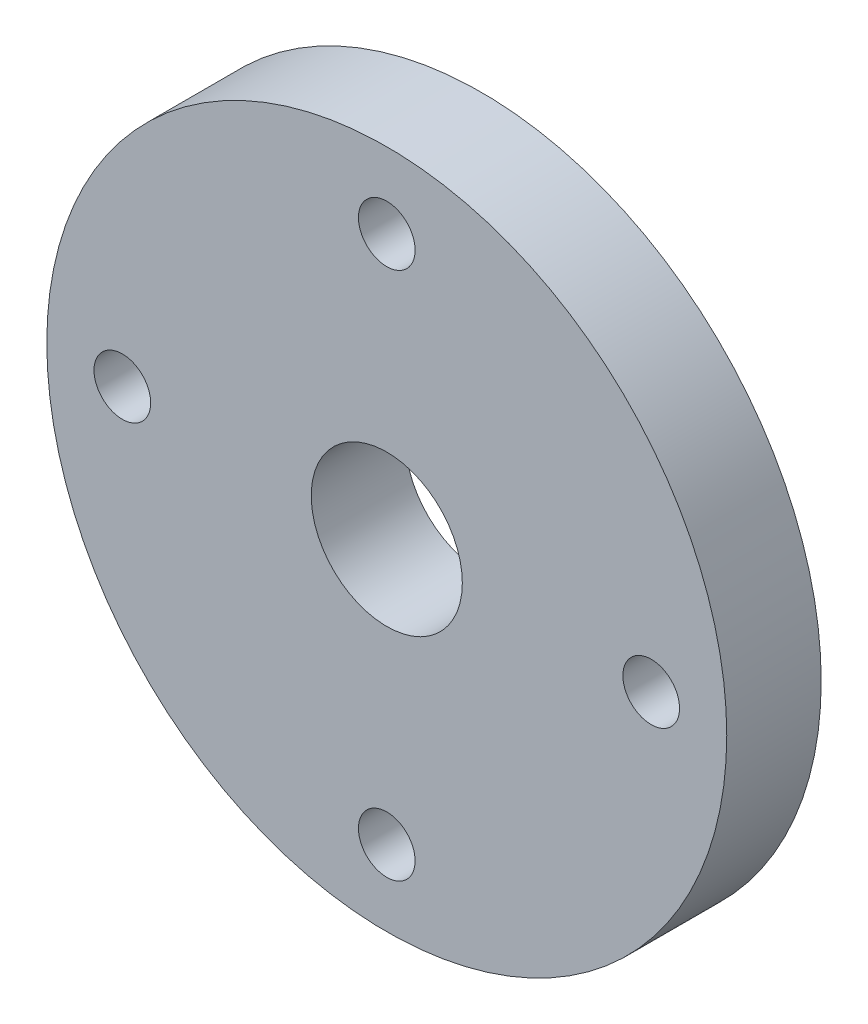
ISO-10303-21;
HEADER;
FILE_DESCRIPTION(('STEP AP214'),'2;1');
FILE_NAME('part.step','',(''),(''),'','','');
FILE_SCHEMA(('AUTOMOTIVE_DESIGN { 1 0 10303 214 1 1 1 1 }'));
ENDSEC;
DATA;
#1=APPLICATION_CONTEXT('core data for automotive mechanical design processes');
#2=APPLICATION_PROTOCOL_DEFINITION('international standard','automotive_design',2000,#1);
#3=PRODUCT_CONTEXT('',#1,'mechanical');
#4=PRODUCT('Part','Part','',(#3));
#5=PRODUCT_RELATED_PRODUCT_CATEGORY('part','',(#4));
#6=PRODUCT_DEFINITION_FORMATION('','',#4);
#7=PRODUCT_DEFINITION_CONTEXT('part definition',#1,'design');
#8=PRODUCT_DEFINITION('design','',#6,#7);
#9=PRODUCT_DEFINITION_SHAPE('','',#8);
#10=(LENGTH_UNIT() NAMED_UNIT(*) SI_UNIT(.MILLI.,.METRE.));
#11=(NAMED_UNIT(*) PLANE_ANGLE_UNIT() SI_UNIT($,.RADIAN.));
#12=(NAMED_UNIT(*) SI_UNIT($,.STERADIAN.) SOLID_ANGLE_UNIT());
#13=UNCERTAINTY_MEASURE_WITH_UNIT(LENGTH_MEASURE(1.E-05),#10,'distance_accuracy_value','');
#14=(GEOMETRIC_REPRESENTATION_CONTEXT(3) GLOBAL_UNCERTAINTY_ASSIGNED_CONTEXT((#13)) GLOBAL_UNIT_ASSIGNED_CONTEXT((#10,
#11,#12)) REPRESENTATION_CONTEXT('',''));
#15=CARTESIAN_POINT('',(0.,0.,0.));
#16=DIRECTION('',(0.,0.,1.));
#17=DIRECTION('',(1.,0.,0.));
#18=AXIS2_PLACEMENT_3D('',#15,#16,#17);
#19=CARTESIAN_POINT('',(0.,0.,5.));
#20=DIRECTION('',(0.,0.,-1.));
#21=DIRECTION('',(-1.,0.,0.));
#22=AXIS2_PLACEMENT_3D('',#19,#20,#21);
#23=CYLINDRICAL_SURFACE('',#22,18.);
#24=CARTESIAN_POINT('',(0.,0.,5.));
#25=DIRECTION('',(0.,0.,1.));
#26=DIRECTION('',(1.,0.,0.));
#27=AXIS2_PLACEMENT_3D('',#24,#25,#26);
#28=CIRCLE('',#27,18.);
#29=CARTESIAN_POINT('',(18.,0.,5.));
#30=VERTEX_POINT('',#29);
#31=EDGE_CURVE('E10',#30,#30,#28,.T.);
#32=ORIENTED_EDGE('',*,*,#31,.F.);
#33=EDGE_LOOP('',(#32));
#34=FACE_BOUND('',#33,.T.);
#35=CARTESIAN_POINT('',(0.,0.,0.));
#36=DIRECTION('',(0.,0.,1.));
#37=DIRECTION('',(1.,0.,0.));
#38=AXIS2_PLACEMENT_3D('',#35,#36,#37);
#39=CIRCLE('',#38,18.);
#40=CARTESIAN_POINT('',(18.,0.,0.));
#41=VERTEX_POINT('',#40);
#42=EDGE_CURVE('E42',#41,#41,#39,.T.);
#43=ORIENTED_EDGE('',*,*,#42,.T.);
#44=EDGE_LOOP('',(#43));
#45=FACE_BOUND('',#44,.T.);
#46=ADVANCED_FACE('F35',(#34,#45),#23,.T.);
#47=CARTESIAN_POINT('',(0.,0.,5.));
#48=DIRECTION('',(0.,0.,1.));
#49=DIRECTION('',(1.,0.,0.));
#50=AXIS2_PLACEMENT_3D('',#47,#48,#49);
#51=PLANE('',#50);
#52=CARTESIAN_POINT('',(0.,14.,5.));
#53=DIRECTION('',(0.,0.,-1.));
#54=DIRECTION('',(-1.,0.,0.));
#55=AXIS2_PLACEMENT_3D('',#52,#53,#54);
#56=CIRCLE('',#55,1.5);
#57=CARTESIAN_POINT('',(-1.5,14.,5.));
#58=VERTEX_POINT('',#57);
#59=EDGE_CURVE('E51',#58,#58,#56,.T.);
#60=ORIENTED_EDGE('',*,*,#59,.T.);
#61=EDGE_LOOP('',(#60));
#62=FACE_BOUND('',#61,.T.);
#63=CARTESIAN_POINT('',(-14.,0.,5.));
#64=DIRECTION('',(0.,0.,-1.));
#65=DIRECTION('',(-1.,0.,0.));
#66=AXIS2_PLACEMENT_3D('',#63,#64,#65);
#67=CIRCLE('',#66,1.5);
#68=CARTESIAN_POINT('',(-15.5,0.,5.));
#69=VERTEX_POINT('',#68);
#70=EDGE_CURVE('E67',#69,#69,#67,.T.);
#71=ORIENTED_EDGE('',*,*,#70,.T.);
#72=EDGE_LOOP('',(#71));
#73=FACE_BOUND('',#72,.T.);
#74=CARTESIAN_POINT('',(0.,-14.,5.));
#75=DIRECTION('',(0.,0.,-1.));
#76=DIRECTION('',(-1.,0.,0.));
#77=AXIS2_PLACEMENT_3D('',#74,#75,#76);
#78=CIRCLE('',#77,1.5);
#79=CARTESIAN_POINT('',(-1.5,-14.,5.));
#80=VERTEX_POINT('',#79);
#81=EDGE_CURVE('E61',#80,#80,#78,.T.);
#82=ORIENTED_EDGE('',*,*,#81,.T.);
#83=EDGE_LOOP('',(#82));
#84=FACE_BOUND('',#83,.T.);
#85=CARTESIAN_POINT('',(14.,0.,5.));
#86=DIRECTION('',(0.,0.,-1.));
#87=DIRECTION('',(-1.,0.,0.));
#88=AXIS2_PLACEMENT_3D('',#85,#86,#87);
#89=CIRCLE('',#88,1.5);
#90=CARTESIAN_POINT('',(12.5,0.,5.));
#91=VERTEX_POINT('',#90);
#92=EDGE_CURVE('E55',#91,#91,#89,.T.);
#93=ORIENTED_EDGE('',*,*,#92,.T.);
#94=EDGE_LOOP('',(#93));
#95=FACE_BOUND('',#94,.T.);
#96=CARTESIAN_POINT('',(0.,0.,5.));
#97=DIRECTION('',(0.,0.,1.));
#98=DIRECTION('',(1.,0.,0.));
#99=AXIS2_PLACEMENT_3D('',#96,#97,#98);
#100=CIRCLE('',#99,4.);
#101=CARTESIAN_POINT('',(4.,0.,4.99999999999999));
#102=VERTEX_POINT('',#101);
#103=EDGE_CURVE('E48',#102,#102,#100,.T.);
#104=ORIENTED_EDGE('',*,*,#103,.F.);
#105=EDGE_LOOP('',(#104));
#106=FACE_BOUND('',#105,.T.);
#107=ORIENTED_EDGE('',*,*,#31,.T.);
#108=EDGE_LOOP('',(#107));
#109=FACE_BOUND('',#108,.T.);
#110=ADVANCED_FACE('F76',(#62,#73,#84,#95,#106,#109),#51,.T.);
#111=CARTESIAN_POINT('',(0.,0.,0.));
#112=DIRECTION('',(0.,0.,1.));
#113=DIRECTION('',(1.,0.,0.));
#114=AXIS2_PLACEMENT_3D('',#111,#112,#113);
#115=PLANE('',#114);
#116=CARTESIAN_POINT('',(0.,14.,0.));
#117=DIRECTION('',(0.,0.,-1.));
#118=DIRECTION('',(-1.,0.,0.));
#119=AXIS2_PLACEMENT_3D('',#116,#117,#118);
#120=CIRCLE('',#119,1.5);
#121=CARTESIAN_POINT('',(-1.5,14.,0.));
#122=VERTEX_POINT('',#121);
#123=EDGE_CURVE('E70',#122,#122,#120,.T.);
#124=ORIENTED_EDGE('',*,*,#123,.F.);
#125=EDGE_LOOP('',(#124));
#126=FACE_BOUND('',#125,.T.);
#127=CARTESIAN_POINT('',(-14.,0.,0.));
#128=DIRECTION('',(0.,0.,-1.));
#129=DIRECTION('',(-1.,0.,0.));
#130=AXIS2_PLACEMENT_3D('',#127,#128,#129);
#131=CIRCLE('',#130,1.5);
#132=CARTESIAN_POINT('',(-15.5,0.,0.));
#133=VERTEX_POINT('',#132);
#134=EDGE_CURVE('E64',#133,#133,#131,.T.);
#135=ORIENTED_EDGE('',*,*,#134,.F.);
#136=EDGE_LOOP('',(#135));
#137=FACE_BOUND('',#136,.T.);
#138=CARTESIAN_POINT('',(0.,-14.,0.));
#139=DIRECTION('',(0.,0.,-1.));
#140=DIRECTION('',(-1.,0.,0.));
#141=AXIS2_PLACEMENT_3D('',#138,#139,#140);
#142=CIRCLE('',#141,1.5);
#143=CARTESIAN_POINT('',(-1.5,-14.,0.));
#144=VERTEX_POINT('',#143);
#145=EDGE_CURVE('E58',#144,#144,#142,.T.);
#146=ORIENTED_EDGE('',*,*,#145,.F.);
#147=EDGE_LOOP('',(#146));
#148=FACE_BOUND('',#147,.T.);
#149=CARTESIAN_POINT('',(14.,0.,0.));
#150=DIRECTION('',(0.,0.,-1.));
#151=DIRECTION('',(-1.,0.,0.));
#152=AXIS2_PLACEMENT_3D('',#149,#150,#151);
#153=CIRCLE('',#152,1.5);
#154=CARTESIAN_POINT('',(12.5,0.,0.));
#155=VERTEX_POINT('',#154);
#156=EDGE_CURVE('E52',#155,#155,#153,.T.);
#157=ORIENTED_EDGE('',*,*,#156,.F.);
#158=EDGE_LOOP('',(#157));
#159=FACE_BOUND('',#158,.T.);
#160=CARTESIAN_POINT('',(0.,0.,0.));
#161=DIRECTION('',(0.,0.,1.));
#162=DIRECTION('',(1.,0.,0.));
#163=AXIS2_PLACEMENT_3D('',#160,#161,#162);
#164=CIRCLE('',#163,4.);
#165=CARTESIAN_POINT('',(4.,0.,0.));
#166=VERTEX_POINT('',#165);
#167=EDGE_CURVE('E38',#166,#166,#164,.T.);
#168=ORIENTED_EDGE('',*,*,#167,.T.);
#169=EDGE_LOOP('',(#168));
#170=FACE_BOUND('',#169,.T.);
#171=ORIENTED_EDGE('',*,*,#42,.F.);
#172=EDGE_LOOP('',(#171));
#173=FACE_BOUND('',#172,.T.);
#174=ADVANCED_FACE('F86',(#126,#137,#148,#159,#170,#173),#115,.F.);
#175=CARTESIAN_POINT('',(0.,0.,-117.));
#176=DIRECTION('',(0.,0.,1.));
#177=DIRECTION('',(1.,0.,0.));
#178=AXIS2_PLACEMENT_3D('',#175,#176,#177);
#179=CYLINDRICAL_SURFACE('',#178,4.);
#180=CARTESIAN_POINT('',(4.,0.,4.99999999999999));
#181=CARTESIAN_POINT('',(4.,0.,4.94791666666666));
#182=CARTESIAN_POINT('',(4.,0.,4.89583333333333));
#183=CARTESIAN_POINT('',(4.,0.,4.79166666666666));
#184=CARTESIAN_POINT('',(4.,0.,4.73958333333333));
#185=CARTESIAN_POINT('',(4.,0.,4.63541666666666));
#186=CARTESIAN_POINT('',(4.,0.,4.58333333333332));
#187=CARTESIAN_POINT('',(4.,0.,4.47916666666665));
#188=CARTESIAN_POINT('',(4.,0.,4.42708333333332));
#189=CARTESIAN_POINT('',(4.,0.,4.32291666666666));
#190=CARTESIAN_POINT('',(4.,0.,4.27083333333333));
#191=CARTESIAN_POINT('',(4.,0.,4.16666666666666));
#192=CARTESIAN_POINT('',(4.,0.,4.11458333333332));
#193=CARTESIAN_POINT('',(4.,0.,4.01041666666665));
#194=CARTESIAN_POINT('',(4.,0.,3.95833333333332));
#195=CARTESIAN_POINT('',(4.,0.,3.85416666666665));
#196=CARTESIAN_POINT('',(4.,0.,3.80208333333332));
#197=CARTESIAN_POINT('',(4.,0.,3.69791666666666));
#198=CARTESIAN_POINT('',(4.,0.,3.64583333333333));
#199=CARTESIAN_POINT('',(4.,0.,3.54166666666666));
#200=CARTESIAN_POINT('',(4.,0.,3.48958333333333));
#201=CARTESIAN_POINT('',(4.,0.,3.38541666666666));
#202=CARTESIAN_POINT('',(4.,0.,3.33333333333332));
#203=CARTESIAN_POINT('',(4.,0.,3.22916666666665));
#204=CARTESIAN_POINT('',(4.,0.,3.17708333333332));
#205=CARTESIAN_POINT('',(4.,0.,3.07291666666666));
#206=CARTESIAN_POINT('',(4.,0.,3.02083333333332));
#207=CARTESIAN_POINT('',(4.,0.,2.91666666666666));
#208=CARTESIAN_POINT('',(4.,0.,2.86458333333332));
#209=CARTESIAN_POINT('',(4.,0.,2.76041666666665));
#210=CARTESIAN_POINT('',(4.,0.,2.70833333333332));
#211=CARTESIAN_POINT('',(4.,0.,2.60416666666665));
#212=CARTESIAN_POINT('',(4.,0.,2.55208333333332));
#213=CARTESIAN_POINT('',(4.,0.,2.44791666666666));
#214=CARTESIAN_POINT('',(4.,0.,2.39583333333332));
#215=CARTESIAN_POINT('',(4.,0.,2.29166666666666));
#216=CARTESIAN_POINT('',(4.,0.,2.23958333333333));
#217=CARTESIAN_POINT('',(4.,0.,2.13541666666666));
#218=CARTESIAN_POINT('',(4.,0.,2.08333333333332));
#219=CARTESIAN_POINT('',(4.,0.,1.97916666666665));
#220=CARTESIAN_POINT('',(4.,0.,1.92708333333332));
#221=CARTESIAN_POINT('',(4.,0.,1.82291666666666));
#222=CARTESIAN_POINT('',(4.,0.,1.77083333333332));
#223=CARTESIAN_POINT('',(4.,0.,1.66666666666665));
#224=CARTESIAN_POINT('',(4.,0.,1.61458333333332));
#225=CARTESIAN_POINT('',(4.,0.,1.51041666666665));
#226=CARTESIAN_POINT('',(4.,0.,1.45833333333332));
#227=CARTESIAN_POINT('',(4.,0.,1.35416666666665));
#228=CARTESIAN_POINT('',(4.,0.,1.30208333333332));
#229=CARTESIAN_POINT('',(4.,0.,1.19791666666665));
#230=CARTESIAN_POINT('',(4.,0.,1.14583333333332));
#231=CARTESIAN_POINT('',(4.,0.,1.04166666666666));
#232=CARTESIAN_POINT('',(4.,0.,0.989583333333326));
#233=CARTESIAN_POINT('',(4.,0.,0.885416666666657));
#234=CARTESIAN_POINT('',(4.,0.,0.83333333333332));
#235=CARTESIAN_POINT('',(4.,0.,0.729166666666651));
#236=CARTESIAN_POINT('',(4.,0.,0.677083333333319));
#237=CARTESIAN_POINT('',(4.,0.,0.572916666666654));
#238=CARTESIAN_POINT('',(4.,0.,0.520833333333322));
#239=CARTESIAN_POINT('',(4.,0.,0.416666666666653));
#240=CARTESIAN_POINT('',(4.,0.,0.364583333333316));
#241=CARTESIAN_POINT('',(4.,0.,0.260416666666647));
#242=CARTESIAN_POINT('',(4.,0.,0.208333333333315));
#243=CARTESIAN_POINT('',(4.,0.,0.104166666666651));
#244=CARTESIAN_POINT('',(4.,0.,0.0520833333333183));
#245=CARTESIAN_POINT('',(4.,0.,0.));
#246=B_SPLINE_CURVE_WITH_KNOTS('',3,(#180,#181,#182,#183,#184,#185,#186,#187,#188,#189,#190,
#191,#192,#193,#194,#195,#196,#197,#198,#199,#200,#201,#202,#203,#204,#205,#206,#207,#208,#209,
#210,#211,#212,#213,#214,#215,#216,#217,#218,#219,#220,#221,#222,#223,#224,#225,#226,#227,#228,
#229,#230,#231,#232,#233,#234,#235,#236,#237,#238,#239,#240,#241,#242,#243,#244,#245),
.UNSPECIFIED.,.F.,.F.,(4,2,2,2,2,2,2,2,2,2,2,2,2,2,2,2,2,2,2,2,2,2,2,2,2,2,2,2,2,2,2,2,4),(0.,
0.156249999999997,0.312499999999993,0.468750000000004,0.625000000000001,0.781249999999997,
0.937500000000008,1.09375,1.25,1.40625,1.56249999999999,1.71875,1.875,2.03125,2.18750000000001,
2.34375000000001,2.5,2.65625,2.8125,2.96875000000001,3.125,3.28125,3.43750000000001,
3.59375000000001,3.75,3.90625,4.0625,4.21875000000001,4.375,4.53125,4.68750000000001,
4.84375000000001,5.),.UNSPECIFIED.);
#247=EDGE_CURVE('BSEAM89',#102,#166,#246,.T.);
#248=ORIENTED_EDGE('',*,*,#103,.T.);
#249=ORIENTED_EDGE('',*,*,#167,.F.);
#250=ORIENTED_EDGE('',*,*,#247,.T.);
#251=ORIENTED_EDGE('',*,*,#247,.F.);
#252=EDGE_LOOP('',(#248,#250,#249,#251));
#253=FACE_BOUND('',#252,.T.);
#254=ADVANCED_FACE('F89',(#253),#179,.F.);
#255=CARTESIAN_POINT('',(14.,0.,5.));
#256=DIRECTION('',(0.,0.,-1.));
#257=DIRECTION('',(-1.,0.,0.));
#258=AXIS2_PLACEMENT_3D('',#255,#256,#257);
#259=CYLINDRICAL_SURFACE('',#258,1.5);
#260=ORIENTED_EDGE('',*,*,#92,.F.);
#261=EDGE_LOOP('',(#260));
#262=FACE_BOUND('',#261,.T.);
#263=ORIENTED_EDGE('',*,*,#156,.T.);
#264=EDGE_LOOP('',(#263));
#265=FACE_BOUND('',#264,.T.);
#266=ADVANCED_FACE('F112',(#262,#265),#259,.F.);
#267=CARTESIAN_POINT('',(0.,-14.,5.));
#268=DIRECTION('',(0.,0.,-1.));
#269=DIRECTION('',(-1.,0.,0.));
#270=AXIS2_PLACEMENT_3D('',#267,#268,#269);
#271=CYLINDRICAL_SURFACE('',#270,1.5);
#272=ORIENTED_EDGE('',*,*,#81,.F.);
#273=EDGE_LOOP('',(#272));
#274=FACE_BOUND('',#273,.T.);
#275=ORIENTED_EDGE('',*,*,#145,.T.);
#276=EDGE_LOOP('',(#275));
#277=FACE_BOUND('',#276,.T.);
#278=ADVANCED_FACE('F116',(#274,#277),#271,.F.);
#279=CARTESIAN_POINT('',(-14.,0.,5.));
#280=DIRECTION('',(0.,0.,-1.));
#281=DIRECTION('',(-1.,0.,0.));
#282=AXIS2_PLACEMENT_3D('',#279,#280,#281);
#283=CYLINDRICAL_SURFACE('',#282,1.5);
#284=ORIENTED_EDGE('',*,*,#70,.F.);
#285=EDGE_LOOP('',(#284));
#286=FACE_BOUND('',#285,.T.);
#287=ORIENTED_EDGE('',*,*,#134,.T.);
#288=EDGE_LOOP('',(#287));
#289=FACE_BOUND('',#288,.T.);
#290=ADVANCED_FACE('F82',(#286,#289),#283,.F.);
#291=CARTESIAN_POINT('',(0.,14.,5.));
#292=DIRECTION('',(0.,0.,-1.));
#293=DIRECTION('',(-1.,0.,0.));
#294=AXIS2_PLACEMENT_3D('',#291,#292,#293);
#295=CYLINDRICAL_SURFACE('',#294,1.5);
#296=ORIENTED_EDGE('',*,*,#59,.F.);
#297=EDGE_LOOP('',(#296));
#298=FACE_BOUND('',#297,.T.);
#299=ORIENTED_EDGE('',*,*,#123,.T.);
#300=EDGE_LOOP('',(#299));
#301=FACE_BOUND('',#300,.T.);
#302=ADVANCED_FACE('F79',(#298,#301),#295,.F.);
#303=CLOSED_SHELL('',(#46,#110,#174,#254,#266,#278,#290,#302));
#304=MANIFOLD_SOLID_BREP('B2',#303);
#305=ADVANCED_BREP_SHAPE_REPRESENTATION('',(#18,#304),#14);
#306=SHAPE_DEFINITION_REPRESENTATION(#9,#305);
ENDSEC;
END-ISO-10303-21;
